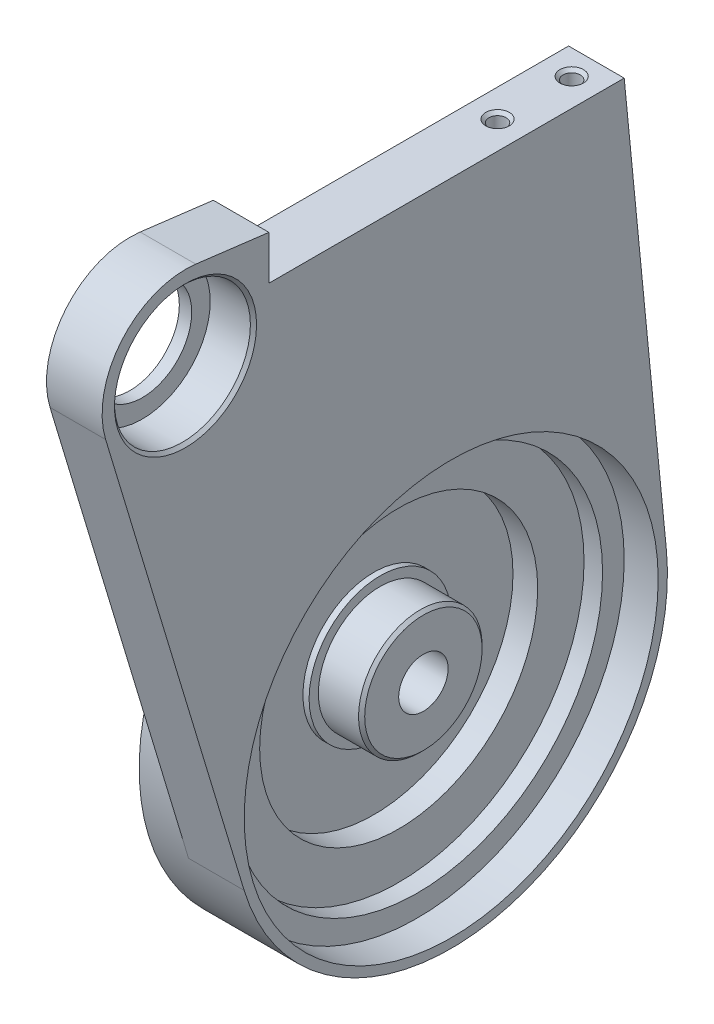
ISO-10303-21;
HEADER;
FILE_DESCRIPTION(('STEP AP214'),'2;1');
FILE_NAME('part.step','',(''),(''),'','','');
FILE_SCHEMA(('AUTOMOTIVE_DESIGN { 1 0 10303 214 1 1 1 1 }'));
ENDSEC;
DATA;
#1=APPLICATION_CONTEXT('core data for automotive mechanical design processes');
#2=APPLICATION_PROTOCOL_DEFINITION('international standard','automotive_design',2000,#1);
#3=PRODUCT_CONTEXT('',#1,'mechanical');
#4=PRODUCT('Part','Part','',(#3));
#5=PRODUCT_RELATED_PRODUCT_CATEGORY('part','',(#4));
#6=PRODUCT_DEFINITION_FORMATION('','',#4);
#7=PRODUCT_DEFINITION_CONTEXT('part definition',#1,'design');
#8=PRODUCT_DEFINITION('design','',#6,#7);
#9=PRODUCT_DEFINITION_SHAPE('','',#8);
#10=(LENGTH_UNIT() NAMED_UNIT(*) SI_UNIT(.MILLI.,.METRE.));
#11=(NAMED_UNIT(*) PLANE_ANGLE_UNIT() SI_UNIT($,.RADIAN.));
#12=(NAMED_UNIT(*) SI_UNIT($,.STERADIAN.) SOLID_ANGLE_UNIT());
#13=UNCERTAINTY_MEASURE_WITH_UNIT(LENGTH_MEASURE(1.E-05),#10,'distance_accuracy_value','');
#14=(GEOMETRIC_REPRESENTATION_CONTEXT(3) GLOBAL_UNCERTAINTY_ASSIGNED_CONTEXT((#13)) GLOBAL_UNIT_ASSIGNED_CONTEXT((#10,
#11,#12)) REPRESENTATION_CONTEXT('',''));
#15=CARTESIAN_POINT('',(0.,0.,0.));
#16=DIRECTION('',(0.,0.,1.));
#17=DIRECTION('',(1.,0.,0.));
#18=AXIS2_PLACEMENT_3D('',#15,#16,#17);
#19=CARTESIAN_POINT('',(-39.,0.,0.));
#20=DIRECTION('',(-1.,0.,0.));
#21=DIRECTION('',(0.,0.,1.));
#22=AXIS2_PLACEMENT_3D('',#19,#20,#21);
#23=CYLINDRICAL_SURFACE('',#22,35.);
#24=DIRECTION('',(-1.,0.,0.));
#25=VECTOR('',#24,1.);
#26=CARTESIAN_POINT('',(-49.5,34.8134096858353,3.60922513099308));
#27=LINE('',#26,#25);
#28=CARTESIAN_POINT('',(-49.,34.8134096858353,3.60922513099308));
#29=VERTEX_POINT('',#28);
#30=CARTESIAN_POINT('',(-51.,34.8134096858353,3.60922513099308));
#31=VERTEX_POINT('',#30);
#32=EDGE_CURVE('E195',#29,#31,#27,.T.);
#33=ORIENTED_EDGE('',*,*,#32,.F.);
#34=CARTESIAN_POINT('',(-49.,34.8134096858353,3.60922513099308));
#35=CARTESIAN_POINT('',(-48.9726356121736,34.8134094352451,3.60922569305726));
#36=CARTESIAN_POINT('',(-48.9452847121818,34.8135305500028,3.60805951301618));
#37=CARTESIAN_POINT('',(-48.8907864964406,34.8140119646794,3.60341213762526));
#38=CARTESIAN_POINT('',(-48.8636391508467,34.8143722288132,3.5999312886317));
#39=CARTESIAN_POINT('',(-48.7829121911346,34.8158036957728,3.58607090046661));
#40=CARTESIAN_POINT('',(-48.7298860989902,34.817225616827,3.5722732710529));
#41=CARTESIAN_POINT('',(-48.626937297955,34.8209224871209,3.53605484832459));
#42=CARTESIAN_POINT('',(-48.5770145523576,34.8231974262688,3.51363415702679));
#43=CARTESIAN_POINT('',(-48.4815436387015,34.8284754079396,3.46092471558382));
#44=CARTESIAN_POINT('',(-48.435996411843,34.831478606628,3.43063427777692));
#45=CARTESIAN_POINT('',(-48.3495567492925,34.8381269942425,3.36245454411341));
#46=CARTESIAN_POINT('',(-48.3087759469558,34.8417838473524,3.32442507321176));
#47=CARTESIAN_POINT('',(-48.2339186226643,34.8495232044921,3.2422880624267));
#48=CARTESIAN_POINT('',(-48.1998440093348,34.853605829195,3.19817879825023));
#49=CARTESIAN_POINT('',(-48.1380694553502,34.8621769230677,3.10337957879432));
#50=CARTESIAN_POINT('',(-48.110651710087,34.8666748156835,3.05250664127353));
#51=CARTESIAN_POINT('',(-48.0645569313515,34.8757542131405,2.94695943233439));
#52=CARTESIAN_POINT('',(-48.0458773749463,34.8803356934504,2.89228626338044));
#53=CARTESIAN_POINT('',(-48.0212581493575,34.8882752153471,2.79463994487654));
#54=CARTESIAN_POINT('',(-48.0132995419636,34.8916523206117,2.75216550508537));
#55=CARTESIAN_POINT('',(-48.002669499544,34.8982964731773,2.66660255618611));
#56=CARTESIAN_POINT('',(-47.9999919401606,34.901563643639,2.62351481681534));
#57=CARTESIAN_POINT('',(-48.,34.9047492831922,2.58040258050802));
#58=B_SPLINE_CURVE_WITH_KNOTS('',3,(#34,#35,#36,#37,#38,#39,#40,#41,#42,#43,#44,#45,#46,#47,#48,
#49,#50,#51,#52,#53,#54,#55,#56,#57),.UNSPECIFIED.,.F.,.F.,(4,2,2,2,2,2,2,2,2,2,2,4),(0.,
0.0820414744675156,0.164070675392366,0.32765072824154,0.49122884588489,0.654842071739815,
0.821735608814192,0.988676576411267,1.16178843583303,1.33485028264958,1.46457326948109,
1.59414572971458),.UNSPECIFIED.);
#59=CARTESIAN_POINT('',(-48.,34.9047492831922,2.58040258050802));
#60=VERTEX_POINT('',#59);
#61=EDGE_CURVE('E64',#29,#60,#58,.T.);
#62=ORIENTED_EDGE('',*,*,#61,.T.);
#63=CARTESIAN_POINT('',(-48.,0.,0.));
#64=DIRECTION('',(1.,0.,0.));
#65=DIRECTION('',(0.,0.,-1.));
#66=AXIS2_PLACEMENT_3D('',#63,#64,#65);
#67=CIRCLE('',#66,35.);
#68=CARTESIAN_POINT('',(-48.,3.42042393123537,-34.8324661792793));
#69=VERTEX_POINT('',#68);
#70=EDGE_CURVE('E231',#60,#69,#67,.F.);
#71=ORIENTED_EDGE('',*,*,#70,.T.);
#72=DIRECTION('',(-1.,0.,0.));
#73=VECTOR('',#72,1.);
#74=CARTESIAN_POINT('',(-39.,3.42042393123537,-34.8324661792793));
#75=LINE('',#74,#73);
#76=CARTESIAN_POINT('',(-39.,3.42042393123537,-34.8324661792793));
#77=VERTEX_POINT('',#76);
#78=EDGE_CURVE('E285',#77,#69,#75,.T.);
#79=ORIENTED_EDGE('',*,*,#78,.F.);
#80=CARTESIAN_POINT('',(-39.,0.,0.));
#81=DIRECTION('',(1.,0.,0.));
#82=DIRECTION('',(0.,0.,-1.));
#83=AXIS2_PLACEMENT_3D('',#80,#81,#82);
#84=CIRCLE('',#83,35.);
#85=CARTESIAN_POINT('',(-39.,-10.0957470928432,33.5123244588815));
#86=VERTEX_POINT('',#85);
#87=EDGE_CURVE('E254',#86,#77,#84,.T.);
#88=ORIENTED_EDGE('',*,*,#87,.F.);
#89=DIRECTION('',(-1.,0.,0.));
#90=VECTOR('',#89,1.);
#91=CARTESIAN_POINT('',(-39.,-10.0957470928432,33.5123244588815));
#92=LINE('',#91,#90);
#93=CARTESIAN_POINT('',(-48.,-10.0957470928432,33.5123244588815));
#94=VERTEX_POINT('',#93);
#95=EDGE_CURVE('E267',#86,#94,#92,.T.);
#96=ORIENTED_EDGE('',*,*,#95,.T.);
#97=CARTESIAN_POINT('',(-48.,31.2349355305614,15.7917320899791));
#98=VERTEX_POINT('',#97);
#99=EDGE_CURVE('E232',#94,#98,#67,.F.);
#100=ORIENTED_EDGE('',*,*,#99,.T.);
#101=CARTESIAN_POINT('',(-48.,31.2349355305614,15.7917320899791));
#102=CARTESIAN_POINT('',(-47.9999592632382,31.2616744252843,15.7388572138157));
#103=CARTESIAN_POINT('',(-48.0050121835829,31.2882606540519,15.6859256306739));
#104=CARTESIAN_POINT('',(-48.0249308728801,31.3404177754603,15.581447752128));
#105=CARTESIAN_POINT('',(-48.0397931056785,31.3659890304682,15.5299009644858));
#106=CARTESIAN_POINT('',(-48.0789645408244,31.4154366771404,15.4296304619864));
#107=CARTESIAN_POINT('',(-48.1032776388826,31.4393123650744,15.3809079208321));
#108=CARTESIAN_POINT('',(-48.1607006999334,31.4847165854457,15.287750032336));
#109=CARTESIAN_POINT('',(-48.1938088531873,31.506245599469,15.2433138055702));
#110=CARTESIAN_POINT('',(-48.2677831373511,31.5462657534545,15.1603177552285));
#111=CARTESIAN_POINT('',(-48.3086081974847,31.5647720505674,15.121728686835));
#112=CARTESIAN_POINT('',(-48.3970623415213,31.5983506779795,15.051436993619));
#113=CARTESIAN_POINT('',(-48.4446919969584,31.6134227195511,15.0197349478182));
#114=CARTESIAN_POINT('',(-48.543968699383,31.6392859195574,14.9651754297504));
#115=CARTESIAN_POINT('',(-48.5954635886536,31.6501863189463,14.9420927106323));
#116=CARTESIAN_POINT('',(-48.7021019951056,31.6679397000589,14.9044299933955));
#117=CARTESIAN_POINT('',(-48.7572411412375,31.6747974361222,14.8898400077256));
#118=CARTESIAN_POINT('',(-48.8440658989104,31.6821099223784,14.8742712566105));
#119=CARTESIAN_POINT('',(-48.87509537446,31.6840576967791,14.870121141594));
#120=CARTESIAN_POINT('',(-48.9374111252453,31.6866554928566,14.8645843372343));
#121=CARTESIAN_POINT('',(-48.968696995447,31.6873072697895,14.8631939102659));
#122=CARTESIAN_POINT('',(-49.,31.687306646543,14.8631960724453));
#123=B_SPLINE_CURVE_WITH_KNOTS('',3,(#101,#102,#103,#104,#105,#106,#107,#108,#109,#110,#111,
#112,#113,#114,#115,#116,#117,#118,#119,#120,#121,#122),.UNSPECIFIED.,.F.,.F.,(4,2,2,2,2,2,2,2,
2,2,4),(0.,0.177513985198611,0.3549640133935,0.532487265389794,0.709974017083849,
0.886541473270198,1.0631237685023,1.23470038567406,1.40607481699872,1.50004007936717,
1.59387799137899),.UNSPECIFIED.);
#124=CARTESIAN_POINT('',(-49.,31.687306646543,14.8631960724453));
#125=VERTEX_POINT('',#124);
#126=EDGE_CURVE('E312',#98,#125,#123,.T.);
#127=ORIENTED_EDGE('',*,*,#126,.T.);
#128=DIRECTION('',(-1.,0.,0.));
#129=VECTOR('',#128,1.);
#130=CARTESIAN_POINT('',(-49.5,31.687306646543,14.8631960724453));
#131=LINE('',#130,#129);
#132=CARTESIAN_POINT('',(-51.,31.687306646543,14.8631960724453));
#133=VERTEX_POINT('',#132);
#134=EDGE_CURVE('E192',#133,#125,#131,.F.);
#135=ORIENTED_EDGE('',*,*,#134,.F.);
#136=CARTESIAN_POINT('',(-51.,0.,0.));
#137=DIRECTION('',(1.,0.,0.));
#138=DIRECTION('',(0.,0.,-1.));
#139=AXIS2_PLACEMENT_3D('',#136,#137,#138);
#140=CIRCLE('',#139,35.);
#141=EDGE_CURVE('E306',#31,#133,#140,.T.);
#142=ORIENTED_EDGE('',*,*,#141,.F.);
#143=EDGE_LOOP('',(#33,#62,#71,#79,#88,#96,#100,#127,#135,#142));
#144=FACE_BOUND('',#143,.T.);
#145=DIRECTION('',(-1.,0.,0.));
#146=VECTOR('',#145,1.);
#147=CARTESIAN_POINT('',(-39.,29.7,18.5178292464317));
#148=LINE('',#147,#146);
#149=CARTESIAN_POINT('',(-54.5,29.7,18.5178292464317));
#150=VERTEX_POINT('',#149);
#151=CARTESIAN_POINT('',(-51.5,29.7,18.5178292464317));
#152=VERTEX_POINT('',#151);
#153=EDGE_CURVE('E149',#150,#152,#148,.F.);
#154=ORIENTED_EDGE('',*,*,#153,.F.);
#155=CARTESIAN_POINT('',(-54.5,0.,0.));
#156=DIRECTION('',(-1.,0.,0.));
#157=DIRECTION('',(0.,0.,1.));
#158=AXIS2_PLACEMENT_3D('',#155,#156,#157);
#159=CIRCLE('',#158,35.);
#160=CARTESIAN_POINT('',(-54.5,34.5246608769892,5.74872084283876));
#161=VERTEX_POINT('',#160);
#162=EDGE_CURVE('E225',#161,#150,#159,.T.);
#163=ORIENTED_EDGE('',*,*,#162,.F.);
#164=DIRECTION('',(-1.,0.,0.));
#165=VECTOR('',#164,1.);
#166=CARTESIAN_POINT('',(-53.,34.5246608769893,5.74872084283872));
#167=LINE('',#166,#165);
#168=CARTESIAN_POINT('',(-51.5,34.5246608769893,5.74872084283873));
#169=VERTEX_POINT('',#168);
#170=EDGE_CURVE('E206',#169,#161,#167,.T.);
#171=ORIENTED_EDGE('',*,*,#170,.F.);
#172=CARTESIAN_POINT('',(-51.5,0.,0.));
#173=DIRECTION('',(1.,0.,0.));
#174=DIRECTION('',(0.,0.,-1.));
#175=AXIS2_PLACEMENT_3D('',#172,#173,#174);
#176=CIRCLE('',#175,35.);
#177=EDGE_CURVE('E290',#169,#152,#176,.T.);
#178=ORIENTED_EDGE('',*,*,#177,.T.);
#179=EDGE_LOOP('',(#154,#163,#171,#178));
#180=FACE_BOUND('',#179,.T.);
#181=ADVANCED_FACE('F40',(#144,#180),#23,.T.);
#182=CARTESIAN_POINT('',(-54.5,4.,0.));
#183=DIRECTION('',(1.,0.,0.));
#184=DIRECTION('',(0.,0.,-1.));
#185=AXIS2_PLACEMENT_3D('',#182,#183,#184);
#186=PLANE('',#185);
#187=CARTESIAN_POINT('',(-54.5,0.,0.));
#188=DIRECTION('',(-1.,0.,0.));
#189=DIRECTION('',(0.,0.,1.));
#190=AXIS2_PLACEMENT_3D('',#187,#188,#189);
#191=CIRCLE('',#190,4.);
#192=CARTESIAN_POINT('',(-54.5,0.,4.));
#193=VERTEX_POINT('',#192);
#194=EDGE_CURVE('E228',#193,#193,#191,.T.);
#195=ORIENTED_EDGE('',*,*,#194,.F.);
#196=EDGE_LOOP('',(#195));
#197=FACE_BOUND('',#196,.T.);
#198=DIRECTION('',(0.,1.,0.));
#199=VECTOR('',#198,1.);
#200=CARTESIAN_POINT('',(-54.5,42.3,10.));
#201=LINE('',#200,#199);
#202=CARTESIAN_POINT('',(-54.5,29.7,10.));
#203=VERTEX_POINT('',#202);
#204=CARTESIAN_POINT('',(-54.5,31.5,10.));
#205=VERTEX_POINT('',#204);
#206=EDGE_CURVE('E158',#203,#205,#201,.T.);
#207=ORIENTED_EDGE('',*,*,#206,.T.);
#208=CARTESIAN_POINT('',(-54.5,36.,10.));
#209=DIRECTION('',(1.,0.,0.));
#210=DIRECTION('',(0.,0.,-1.));
#211=AXIS2_PLACEMENT_3D('',#208,#209,#210);
#212=CIRCLE('',#211,4.5);
#213=EDGE_CURVE('E204',#205,#161,#212,.T.);
#214=ORIENTED_EDGE('',*,*,#213,.T.);
#215=ORIENTED_EDGE('',*,*,#162,.T.);
#216=DIRECTION('',(0.,0.,-1.));
#217=VECTOR('',#216,1.);
#218=CARTESIAN_POINT('',(-54.5,29.7,10.));
#219=LINE('',#218,#217);
#220=EDGE_CURVE('E164',#150,#203,#219,.T.);
#221=ORIENTED_EDGE('',*,*,#220,.T.);
#222=EDGE_LOOP('',(#207,#214,#215,#221));
#223=FACE_BOUND('',#222,.T.);
#224=ADVANCED_FACE('F332',(#197,#223),#186,.F.);
#225=CARTESIAN_POINT('',(-51.5,36.,10.));
#226=DIRECTION('',(-1.,0.,0.));
#227=DIRECTION('',(0.,0.,1.));
#228=AXIS2_PLACEMENT_3D('',#225,#226,#227);
#229=CYLINDRICAL_SURFACE('',#228,4.5);
#230=ORIENTED_EDGE('',*,*,#213,.F.);
#231=DIRECTION('',(-1.,0.,0.));
#232=VECTOR('',#231,1.);
#233=CARTESIAN_POINT('',(-51.5,31.5,10.));
#234=LINE('',#233,#232);
#235=CARTESIAN_POINT('',(-51.5,31.5,10.));
#236=VERTEX_POINT('',#235);
#237=EDGE_CURVE('E11',#205,#236,#234,.F.);
#238=ORIENTED_EDGE('',*,*,#237,.T.);
#239=CARTESIAN_POINT('',(-51.5,36.,10.));
#240=DIRECTION('',(1.,0.,0.));
#241=DIRECTION('',(0.,0.,-1.));
#242=AXIS2_PLACEMENT_3D('',#239,#240,#241);
#243=CIRCLE('',#242,4.5);
#244=EDGE_CURVE('E163',#236,#169,#243,.T.);
#245=ORIENTED_EDGE('',*,*,#244,.T.);
#246=ORIENTED_EDGE('',*,*,#170,.T.);
#247=EDGE_LOOP('',(#230,#238,#245,#246));
#248=FACE_BOUND('',#247,.T.);
#249=ADVANCED_FACE('F382',(#248),#229,.F.);
#250=CARTESIAN_POINT('',(-51.5,0.,0.));
#251=DIRECTION('',(1.,0.,0.));
#252=DIRECTION('',(0.,0.,-1.));
#253=AXIS2_PLACEMENT_3D('',#250,#251,#252);
#254=CYLINDRICAL_SURFACE('',#253,22.5);
#255=CARTESIAN_POINT('',(-51.5,0.,0.));
#256=DIRECTION('',(-1.,0.,0.));
#257=DIRECTION('',(0.,0.,1.));
#258=AXIS2_PLACEMENT_3D('',#255,#256,#257);
#259=CIRCLE('',#258,22.5);
#260=CARTESIAN_POINT('',(-51.5,0.,22.5));
#261=VERTEX_POINT('',#260);
#262=EDGE_CURVE('E222',#261,#261,#259,.T.);
#263=ORIENTED_EDGE('',*,*,#262,.T.);
#264=EDGE_LOOP('',(#263));
#265=FACE_BOUND('',#264,.T.);
#266=CARTESIAN_POINT('',(-47.5,0.,0.));
#267=DIRECTION('',(1.,0.,0.));
#268=DIRECTION('',(0.,0.,-1.));
#269=AXIS2_PLACEMENT_3D('',#266,#267,#268);
#270=CIRCLE('',#269,22.5);
#271=CARTESIAN_POINT('',(-47.5,0.,-22.5));
#272=VERTEX_POINT('',#271);
#273=EDGE_CURVE('E174',#272,#272,#270,.F.);
#274=ORIENTED_EDGE('',*,*,#273,.F.);
#275=EDGE_LOOP('',(#274));
#276=FACE_BOUND('',#275,.T.);
#277=ADVANCED_FACE('F377',(#265,#276),#254,.F.);
#278=CARTESIAN_POINT('',(-39.,68.2,43.));
#279=DIRECTION('',(-1.,0.,0.));
#280=DIRECTION('',(0.,0.,1.));
#281=AXIS2_PLACEMENT_3D('',#278,#279,#280);
#282=CYLINDRICAL_SURFACE('',#281,8.);
#283=CARTESIAN_POINT('',(-48.,68.2,43.));
#284=DIRECTION('',(1.,0.,0.));
#285=DIRECTION('',(0.,0.,-1.));
#286=AXIS2_PLACEMENT_3D('',#283,#284,#285);
#287=CIRCLE('',#286,8.);
#288=CARTESIAN_POINT('',(-48.,68.2,35.));
#289=VERTEX_POINT('',#288);
#290=EDGE_CURVE('E201',#289,#289,#287,.T.);
#291=ORIENTED_EDGE('',*,*,#290,.F.);
#292=EDGE_LOOP('',(#291));
#293=FACE_BOUND('',#292,.T.);
#294=CARTESIAN_POINT('',(-46.,68.2,43.));
#295=DIRECTION('',(1.,0.,0.));
#296=DIRECTION('',(0.,0.,-1.));
#297=AXIS2_PLACEMENT_3D('',#294,#295,#296);
#298=CIRCLE('',#297,8.);
#299=CARTESIAN_POINT('',(-46.,68.2,35.));
#300=VERTEX_POINT('',#299);
#301=EDGE_CURVE('E200',#300,#300,#298,.T.);
#302=ORIENTED_EDGE('',*,*,#301,.T.);
#303=EDGE_LOOP('',(#302));
#304=FACE_BOUND('',#303,.T.);
#305=ADVANCED_FACE('F373',(#293,#304),#282,.F.);
#306=CARTESIAN_POINT('',(-48.,0.,0.));
#307=DIRECTION('',(1.,0.,0.));
#308=DIRECTION('',(0.,0.,-1.));
#309=AXIS2_PLACEMENT_3D('',#306,#307,#308);
#310=PLANE('',#309);
#311=ORIENTED_EDGE('',*,*,#70,.F.);
#312=CARTESIAN_POINT('',(-48.,36.,10.));
#313=DIRECTION('',(1.,0.,0.));
#314=DIRECTION('',(0.,0.,-1.));
#315=AXIS2_PLACEMENT_3D('',#312,#313,#314);
#316=CIRCLE('',#315,7.5);
#317=EDGE_CURVE('E56',#60,#98,#316,.T.);
#318=ORIENTED_EDGE('',*,*,#317,.T.);
#319=ORIENTED_EDGE('',*,*,#99,.F.);
#320=DIRECTION('',(0.,-0.957494984539472,-0.288449916938376));
#321=VECTOR('',#320,1.);
#322=CARTESIAN_POINT('',(-48.,64.3059261213319,55.9261822912829));
#323=LINE('',#322,#321);
#324=CARTESIAN_POINT('',(-48.,64.3059261213319,55.9261822912829));
#325=VERTEX_POINT('',#324);
#326=EDGE_CURVE('E258',#325,#94,#323,.T.);
#327=ORIENTED_EDGE('',*,*,#326,.F.);
#328=CARTESIAN_POINT('',(-48.,68.2,43.));
#329=DIRECTION('',(1.,0.,0.));
#330=DIRECTION('',(0.,0.,-1.));
#331=AXIS2_PLACEMENT_3D('',#328,#329,#330);
#332=CIRCLE('',#331,13.5);
#333=CARTESIAN_POINT('',(-48.,81.5974080947529,41.3388388571093));
#334=VERTEX_POINT('',#333);
#335=EDGE_CURVE('E272',#334,#325,#332,.T.);
#336=ORIENTED_EDGE('',*,*,#335,.F.);
#337=DIRECTION('',(0.,0.123048973547403,0.992400599611332));
#338=VECTOR('',#337,1.);
#339=CARTESIAN_POINT('',(-48.,73.,-28.));
#340=LINE('',#339,#338);
#341=CARTESIAN_POINT('',(-48.,80.1294958726815,29.5));
#342=VERTEX_POINT('',#341);
#343=EDGE_CURVE('E270',#342,#334,#340,.T.);
#344=ORIENTED_EDGE('',*,*,#343,.F.);
#345=DIRECTION('',(0.,1.,0.));
#346=VECTOR('',#345,1.);
#347=CARTESIAN_POINT('',(-48.,0.,29.5));
#348=LINE('',#347,#346);
#349=CARTESIAN_POINT('',(-48.,73.,29.5));
#350=VERTEX_POINT('',#349);
#351=EDGE_CURVE('E288',#350,#342,#348,.T.);
#352=ORIENTED_EDGE('',*,*,#351,.F.);
#353=DIRECTION('',(0.,0.,-1.));
#354=VECTOR('',#353,1.);
#355=CARTESIAN_POINT('',(-48.,73.,29.5));
#356=LINE('',#355,#354);
#357=CARTESIAN_POINT('',(-48.,73.,-28.));
#358=VERTEX_POINT('',#357);
#359=EDGE_CURVE('E238',#350,#358,#356,.T.);
#360=ORIENTED_EDGE('',*,*,#359,.T.);
#361=DIRECTION('',(0.,0.995213319407978,0.0977263980352962));
#362=VECTOR('',#361,1.);
#363=CARTESIAN_POINT('',(-48.,3.42042393123537,-34.8324661792793));
#364=LINE('',#363,#362);
#365=EDGE_CURVE('E253',#69,#358,#364,.T.);
#366=ORIENTED_EDGE('',*,*,#365,.F.);
#367=EDGE_LOOP('',(#311,#318,#319,#327,#336,#344,#352,#360,#366));
#368=FACE_BOUND('',#367,.T.);
#369=ORIENTED_EDGE('',*,*,#290,.T.);
#370=EDGE_LOOP('',(#369));
#371=FACE_BOUND('',#370,.T.);
#372=ADVANCED_FACE('F376',(#368,#371),#310,.F.);
#373=CARTESIAN_POINT('',(-39.,73.,-28.));
#374=DIRECTION('',(0.,-0.992400599611332,0.123048973547403));
#375=DIRECTION('',(0.,-0.123048973547403,-0.992400599611332));
#376=AXIS2_PLACEMENT_3D('',#373,#374,#375);
#377=PLANE('',#376);
#378=DIRECTION('',(1.,0.,0.));
#379=VECTOR('',#378,1.);
#380=CARTESIAN_POINT('',(-39.,80.1294958726815,29.5));
#381=LINE('',#380,#379);
#382=CARTESIAN_POINT('',(-39.,80.1294958726815,29.5));
#383=VERTEX_POINT('',#382);
#384=EDGE_CURVE('E251',#342,#383,#381,.T.);
#385=ORIENTED_EDGE('',*,*,#384,.F.);
#386=ORIENTED_EDGE('',*,*,#343,.T.);
#387=DIRECTION('',(-1.,0.,0.));
#388=VECTOR('',#387,1.);
#389=CARTESIAN_POINT('',(-39.,81.5974080947529,41.3388388571093));
#390=LINE('',#389,#388);
#391=CARTESIAN_POINT('',(-39.,81.5974080947529,41.3388388571093));
#392=VERTEX_POINT('',#391);
#393=EDGE_CURVE('E280',#392,#334,#390,.T.);
#394=ORIENTED_EDGE('',*,*,#393,.F.);
#395=DIRECTION('',(0.,0.123048973547403,0.992400599611332));
#396=VECTOR('',#395,1.);
#397=CARTESIAN_POINT('',(-39.,73.,-28.));
#398=LINE('',#397,#396);
#399=EDGE_CURVE('E261',#383,#392,#398,.T.);
#400=ORIENTED_EDGE('',*,*,#399,.F.);
#401=EDGE_LOOP('',(#385,#386,#394,#400));
#402=FACE_BOUND('',#401,.T.);
#403=ADVANCED_FACE('F435',(#402),#377,.F.);
#404=CARTESIAN_POINT('',(-39.,0.,0.));
#405=DIRECTION('',(1.,0.,0.));
#406=DIRECTION('',(0.,0.,-1.));
#407=AXIS2_PLACEMENT_3D('',#404,#405,#406);
#408=PLANE('',#407);
#409=CARTESIAN_POINT('',(-39.,68.2,43.));
#410=DIRECTION('',(1.,0.,0.));
#411=DIRECTION('',(0.,0.,-1.));
#412=AXIS2_PLACEMENT_3D('',#409,#410,#411);
#413=CIRCLE('',#412,11.5);
#414=CARTESIAN_POINT('',(-39.,68.2,31.5));
#415=VERTEX_POINT('',#414);
#416=EDGE_CURVE('E303',#415,#415,#413,.F.);
#417=ORIENTED_EDGE('',*,*,#416,.T.);
#418=EDGE_LOOP('',(#417));
#419=FACE_BOUND('',#418,.T.);
#420=CARTESIAN_POINT('',(-39.,0.,0.));
#421=DIRECTION('',(1.,0.,0.));
#422=DIRECTION('',(0.,0.,-1.));
#423=AXIS2_PLACEMENT_3D('',#420,#421,#422);
#424=CIRCLE('',#423,33.5);
#425=CARTESIAN_POINT('',(-39.,0.,-33.5));
#426=VERTEX_POINT('',#425);
#427=EDGE_CURVE('E234',#426,#426,#424,.T.);
#428=ORIENTED_EDGE('',*,*,#427,.F.);
#429=EDGE_LOOP('',(#428));
#430=FACE_BOUND('',#429,.T.);
#431=CARTESIAN_POINT('',(-39.,68.2,43.));
#432=DIRECTION('',(1.,0.,0.));
#433=DIRECTION('',(0.,0.,-1.));
#434=AXIS2_PLACEMENT_3D('',#431,#432,#433);
#435=CIRCLE('',#434,13.5);
#436=CARTESIAN_POINT('',(-39.,64.3059261213319,55.9261822912829));
#437=VERTEX_POINT('',#436);
#438=EDGE_CURVE('E263',#392,#437,#435,.T.);
#439=ORIENTED_EDGE('',*,*,#438,.T.);
#440=DIRECTION('',(0.,-0.957494984539472,-0.288449916938376));
#441=VECTOR('',#440,1.);
#442=CARTESIAN_POINT('',(-39.,64.3059261213319,55.9261822912829));
#443=LINE('',#442,#441);
#444=EDGE_CURVE('E265',#437,#86,#443,.T.);
#445=ORIENTED_EDGE('',*,*,#444,.T.);
#446=ORIENTED_EDGE('',*,*,#87,.T.);
#447=DIRECTION('',(0.,0.995213319407978,0.0977263980352962));
#448=VECTOR('',#447,1.);
#449=CARTESIAN_POINT('',(-39.,3.42042393123537,-34.8324661792793));
#450=LINE('',#449,#448);
#451=CARTESIAN_POINT('',(-39.,73.,-28.));
#452=VERTEX_POINT('',#451);
#453=EDGE_CURVE('E257',#77,#452,#450,.T.);
#454=ORIENTED_EDGE('',*,*,#453,.T.);
#455=DIRECTION('',(0.,0.,1.));
#456=VECTOR('',#455,1.);
#457=CARTESIAN_POINT('',(-39.,73.,0.));
#458=LINE('',#457,#456);
#459=CARTESIAN_POINT('',(-39.,73.,29.5));
#460=VERTEX_POINT('',#459);
#461=EDGE_CURVE('E245',#452,#460,#458,.T.);
#462=ORIENTED_EDGE('',*,*,#461,.T.);
#463=DIRECTION('',(0.,1.,0.));
#464=VECTOR('',#463,1.);
#465=CARTESIAN_POINT('',(-39.,0.,29.5));
#466=LINE('',#465,#464);
#467=EDGE_CURVE('E248',#460,#383,#466,.T.);
#468=ORIENTED_EDGE('',*,*,#467,.T.);
#469=ORIENTED_EDGE('',*,*,#399,.T.);
#470=EDGE_LOOP('',(#439,#445,#446,#454,#462,#468,#469));
#471=FACE_BOUND('',#470,.T.);
#472=ADVANCED_FACE('F432',(#419,#430,#471),#408,.T.);
#473=CARTESIAN_POINT('',(-39.,3.42042393123537,-34.8324661792793));
#474=DIRECTION('',(0.,-0.0977263980352962,0.995213319407978));
#475=DIRECTION('',(0.,-0.995213319407978,-0.0977263980352962));
#476=AXIS2_PLACEMENT_3D('',#473,#474,#475);
#477=PLANE('',#476);
#478=ORIENTED_EDGE('',*,*,#365,.T.);
#479=DIRECTION('',(-1.,0.,0.));
#480=VECTOR('',#479,1.);
#481=CARTESIAN_POINT('',(-39.,73.,-28.));
#482=LINE('',#481,#480);
#483=EDGE_CURVE('E283',#452,#358,#482,.T.);
#484=ORIENTED_EDGE('',*,*,#483,.F.);
#485=ORIENTED_EDGE('',*,*,#453,.F.);
#486=ORIENTED_EDGE('',*,*,#78,.T.);
#487=EDGE_LOOP('',(#478,#484,#485,#486));
#488=FACE_BOUND('',#487,.T.);
#489=ADVANCED_FACE('F333',(#488),#477,.F.);
#490=CARTESIAN_POINT('',(-39.,68.2,43.));
#491=DIRECTION('',(-1.,0.,0.));
#492=DIRECTION('',(0.,0.,1.));
#493=AXIS2_PLACEMENT_3D('',#490,#491,#492);
#494=CYLINDRICAL_SURFACE('',#493,13.5);
#495=ORIENTED_EDGE('',*,*,#335,.T.);
#496=DIRECTION('',(-1.,0.,0.));
#497=VECTOR('',#496,1.);
#498=CARTESIAN_POINT('',(-39.,64.3059261213319,55.9261822912829));
#499=LINE('',#498,#497);
#500=EDGE_CURVE('E277',#437,#325,#499,.T.);
#501=ORIENTED_EDGE('',*,*,#500,.F.);
#502=ORIENTED_EDGE('',*,*,#438,.F.);
#503=ORIENTED_EDGE('',*,*,#393,.T.);
#504=EDGE_LOOP('',(#495,#501,#502,#503));
#505=FACE_BOUND('',#504,.T.);
#506=ADVANCED_FACE('F441',(#505),#494,.T.);
#507=CARTESIAN_POINT('',(-39.,64.3059261213319,55.9261822912829));
#508=DIRECTION('',(0.,0.288449916938376,-0.957494984539472));
#509=DIRECTION('',(0.,0.957494984539472,0.288449916938377));
#510=AXIS2_PLACEMENT_3D('',#507,#508,#509);
#511=PLANE('',#510);
#512=ORIENTED_EDGE('',*,*,#326,.T.);
#513=ORIENTED_EDGE('',*,*,#95,.F.);
#514=ORIENTED_EDGE('',*,*,#444,.F.);
#515=ORIENTED_EDGE('',*,*,#500,.T.);
#516=EDGE_LOOP('',(#512,#513,#514,#515));
#517=FACE_BOUND('',#516,.T.);
#518=ADVANCED_FACE('F430',(#517),#511,.F.);
#519=CARTESIAN_POINT('',(-8.,150.,29.5));
#520=DIRECTION('',(0.,0.,-1.));
#521=DIRECTION('',(-1.,0.,0.));
#522=AXIS2_PLACEMENT_3D('',#519,#520,#521);
#523=PLANE('',#522);
#524=ORIENTED_EDGE('',*,*,#384,.T.);
#525=ORIENTED_EDGE('',*,*,#467,.F.);
#526=DIRECTION('',(-1.,0.,0.));
#527=VECTOR('',#526,1.);
#528=CARTESIAN_POINT('',(-8.,73.,29.5));
#529=LINE('',#528,#527);
#530=EDGE_CURVE('E243',#460,#350,#529,.T.);
#531=ORIENTED_EDGE('',*,*,#530,.T.);
#532=ORIENTED_EDGE('',*,*,#351,.T.);
#533=EDGE_LOOP('',(#524,#525,#531,#532));
#534=FACE_BOUND('',#533,.T.);
#535=ADVANCED_FACE('F426',(#534),#523,.T.);
#536=CARTESIAN_POINT('',(-8.,73.,29.5));
#537=DIRECTION('',(0.,1.,0.));
#538=DIRECTION('',(0.,0.,1.));
#539=AXIS2_PLACEMENT_3D('',#536,#537,#538);
#540=PLANE('',#539);
#541=CARTESIAN_POINT('',(-43.5,73.,-24.));
#542=DIRECTION('',(0.,1.,0.));
#543=DIRECTION('',(0.,0.,1.));
#544=AXIS2_PLACEMENT_3D('',#541,#542,#543);
#545=CIRCLE('',#544,1.89999999999999);
#546=CARTESIAN_POINT('',(-43.5,73.,-22.1));
#547=VERTEX_POINT('',#546);
#548=EDGE_CURVE('E481',#547,#547,#545,.F.);
#549=ORIENTED_EDGE('',*,*,#548,.T.);
#550=EDGE_LOOP('',(#549));
#551=FACE_BOUND('',#550,.T.);
#552=CARTESIAN_POINT('',(-43.5,73.,-12.));
#553=DIRECTION('',(0.,1.,0.));
#554=DIRECTION('',(0.,0.,1.));
#555=AXIS2_PLACEMENT_3D('',#552,#553,#554);
#556=CIRCLE('',#555,1.90000000000003);
#557=CARTESIAN_POINT('',(-43.5,73.,-10.1));
#558=VERTEX_POINT('',#557);
#559=EDGE_CURVE('E476',#558,#558,#556,.F.);
#560=ORIENTED_EDGE('',*,*,#559,.T.);
#561=EDGE_LOOP('',(#560));
#562=FACE_BOUND('',#561,.T.);
#563=ORIENTED_EDGE('',*,*,#483,.T.);
#564=ORIENTED_EDGE('',*,*,#359,.F.);
#565=ORIENTED_EDGE('',*,*,#530,.F.);
#566=ORIENTED_EDGE('',*,*,#461,.F.);
#567=EDGE_LOOP('',(#563,#564,#565,#566));
#568=FACE_BOUND('',#567,.T.);
#569=ADVANCED_FACE('F422',(#551,#562,#568),#540,.T.);
#570=CARTESIAN_POINT('',(-44.5,0.,0.));
#571=DIRECTION('',(1.,0.,0.));
#572=DIRECTION('',(0.,0.,-1.));
#573=AXIS2_PLACEMENT_3D('',#570,#571,#572);
#574=CYLINDRICAL_SURFACE('',#573,33.5);
#575=CARTESIAN_POINT('',(-44.5,0.,0.));
#576=DIRECTION('',(1.,0.,0.));
#577=DIRECTION('',(0.,0.,-1.));
#578=AXIS2_PLACEMENT_3D('',#575,#576,#577);
#579=CIRCLE('',#578,33.5);
#580=CARTESIAN_POINT('',(-44.5,0.,-33.5));
#581=VERTEX_POINT('',#580);
#582=EDGE_CURVE('E235',#581,#581,#579,.T.);
#583=ORIENTED_EDGE('',*,*,#582,.F.);
#584=EDGE_LOOP('',(#583));
#585=FACE_BOUND('',#584,.T.);
#586=ORIENTED_EDGE('',*,*,#427,.T.);
#587=EDGE_LOOP('',(#586));
#588=FACE_BOUND('',#587,.T.);
#589=ADVANCED_FACE('F418',(#585,#588),#574,.F.);
#590=CARTESIAN_POINT('',(-44.5,0.,0.));
#591=DIRECTION('',(1.,0.,0.));
#592=DIRECTION('',(0.,0.,-1.));
#593=AXIS2_PLACEMENT_3D('',#590,#591,#592);
#594=PLANE('',#593);
#595=CARTESIAN_POINT('',(-44.5,0.,0.));
#596=DIRECTION('',(1.,0.,0.));
#597=DIRECTION('',(0.,0.,-1.));
#598=AXIS2_PLACEMENT_3D('',#595,#596,#597);
#599=CIRCLE('',#598,30.);
#600=CARTESIAN_POINT('',(-44.5,0.,-30.));
#601=VERTEX_POINT('',#600);
#602=EDGE_CURVE('E170',#601,#601,#599,.T.);
#603=ORIENTED_EDGE('',*,*,#602,.F.);
#604=EDGE_LOOP('',(#603));
#605=FACE_BOUND('',#604,.T.);
#606=ORIENTED_EDGE('',*,*,#582,.T.);
#607=EDGE_LOOP('',(#606));
#608=FACE_BOUND('',#607,.T.);
#609=ADVANCED_FACE('F411',(#605,#608),#594,.T.);
#610=CARTESIAN_POINT('',(-10.123,0.,0.));
#611=DIRECTION('',(-1.,0.,0.));
#612=DIRECTION('',(0.,0.,1.));
#613=AXIS2_PLACEMENT_3D('',#610,#611,#612);
#614=CYLINDRICAL_SURFACE('',#613,4.);
#615=CARTESIAN_POINT('',(-43.5,0.,0.));
#616=DIRECTION('',(-1.,0.,0.));
#617=DIRECTION('',(0.,0.,1.));
#618=AXIS2_PLACEMENT_3D('',#615,#616,#617);
#619=CIRCLE('',#618,4.);
#620=CARTESIAN_POINT('',(-43.5,0.,4.));
#621=VERTEX_POINT('',#620);
#622=EDGE_CURVE('E210',#621,#621,#619,.T.);
#623=ORIENTED_EDGE('',*,*,#622,.F.);
#624=EDGE_LOOP('',(#623));
#625=FACE_BOUND('',#624,.T.);
#626=ORIENTED_EDGE('',*,*,#194,.T.);
#627=EDGE_LOOP('',(#626));
#628=FACE_BOUND('',#627,.T.);
#629=ADVANCED_FACE('F404',(#625,#628),#614,.F.);
#630=CARTESIAN_POINT('',(-51.5,22.5,0.));
#631=DIRECTION('',(-1.,0.,0.));
#632=DIRECTION('',(0.,0.,1.));
#633=AXIS2_PLACEMENT_3D('',#630,#631,#632);
#634=PLANE('',#633);
#635=ORIENTED_EDGE('',*,*,#262,.F.);
#636=EDGE_LOOP('',(#635));
#637=FACE_BOUND('',#636,.T.);
#638=CARTESIAN_POINT('',(-51.5,0.,0.));
#639=DIRECTION('',(-1.,0.,0.));
#640=DIRECTION('',(0.,0.,1.));
#641=AXIS2_PLACEMENT_3D('',#638,#639,#640);
#642=CIRCLE('',#641,11.5);
#643=CARTESIAN_POINT('',(-51.5,0.,11.5));
#644=VERTEX_POINT('',#643);
#645=EDGE_CURVE('E219',#644,#644,#642,.T.);
#646=ORIENTED_EDGE('',*,*,#645,.T.);
#647=EDGE_LOOP('',(#646));
#648=FACE_BOUND('',#647,.T.);
#649=ADVANCED_FACE('F400',(#637,#648),#634,.F.);
#650=CARTESIAN_POINT('',(-10.123,0.,0.));
#651=DIRECTION('',(-1.,0.,0.));
#652=DIRECTION('',(0.,0.,1.));
#653=AXIS2_PLACEMENT_3D('',#650,#651,#652);
#654=CYLINDRICAL_SURFACE('',#653,11.5);
#655=ORIENTED_EDGE('',*,*,#645,.F.);
#656=EDGE_LOOP('',(#655));
#657=FACE_BOUND('',#656,.T.);
#658=CARTESIAN_POINT('',(-50.5,0.,0.));
#659=DIRECTION('',(-1.,0.,0.));
#660=DIRECTION('',(0.,0.,1.));
#661=AXIS2_PLACEMENT_3D('',#658,#659,#660);
#662=CIRCLE('',#661,11.5);
#663=CARTESIAN_POINT('',(-50.5,0.,11.5));
#664=VERTEX_POINT('',#663);
#665=EDGE_CURVE('E216',#664,#664,#662,.T.);
#666=ORIENTED_EDGE('',*,*,#665,.T.);
#667=EDGE_LOOP('',(#666));
#668=FACE_BOUND('',#667,.T.);
#669=ADVANCED_FACE('F396',(#657,#668),#654,.T.);
#670=CARTESIAN_POINT('',(-50.5,11.5,0.));
#671=DIRECTION('',(-1.,0.,0.));
#672=DIRECTION('',(0.,0.,1.));
#673=AXIS2_PLACEMENT_3D('',#670,#671,#672);
#674=PLANE('',#673);
#675=ORIENTED_EDGE('',*,*,#665,.F.);
#676=EDGE_LOOP('',(#675));
#677=FACE_BOUND('',#676,.T.);
#678=CARTESIAN_POINT('',(-50.5,0.,0.));
#679=DIRECTION('',(-1.,0.,0.));
#680=DIRECTION('',(0.,0.,1.));
#681=AXIS2_PLACEMENT_3D('',#678,#679,#680);
#682=CIRCLE('',#681,10.);
#683=CARTESIAN_POINT('',(-50.5,0.,10.));
#684=VERTEX_POINT('',#683);
#685=EDGE_CURVE('E213',#684,#684,#682,.T.);
#686=ORIENTED_EDGE('',*,*,#685,.T.);
#687=EDGE_LOOP('',(#686));
#688=FACE_BOUND('',#687,.T.);
#689=ADVANCED_FACE('F392',(#677,#688),#674,.F.);
#690=CARTESIAN_POINT('',(-10.123,0.,0.));
#691=DIRECTION('',(-1.,0.,0.));
#692=DIRECTION('',(0.,0.,1.));
#693=AXIS2_PLACEMENT_3D('',#690,#691,#692);
#694=CYLINDRICAL_SURFACE('',#693,10.);
#695=CARTESIAN_POINT('',(-44.,0.,0.));
#696=DIRECTION('',(-1.,0.,0.));
#697=DIRECTION('',(0.,0.,1.));
#698=AXIS2_PLACEMENT_3D('',#695,#696,#697);
#699=CIRCLE('',#698,10.);
#700=CARTESIAN_POINT('',(-44.,0.,10.));
#701=VERTEX_POINT('',#700);
#702=EDGE_CURVE('E292',#701,#701,#699,.T.);
#703=ORIENTED_EDGE('',*,*,#702,.T.);
#704=EDGE_LOOP('',(#703));
#705=FACE_BOUND('',#704,.T.);
#706=ORIENTED_EDGE('',*,*,#685,.F.);
#707=EDGE_LOOP('',(#706));
#708=FACE_BOUND('',#707,.T.);
#709=ADVANCED_FACE('F388',(#705,#708),#694,.T.);
#710=CARTESIAN_POINT('',(-43.5,10.,0.));
#711=DIRECTION('',(-1.,0.,0.));
#712=DIRECTION('',(0.,0.,1.));
#713=AXIS2_PLACEMENT_3D('',#710,#711,#712);
#714=PLANE('',#713);
#715=CARTESIAN_POINT('',(-43.5,0.,0.));
#716=DIRECTION('',(-1.,0.,0.));
#717=DIRECTION('',(0.,0.,1.));
#718=AXIS2_PLACEMENT_3D('',#715,#716,#717);
#719=CIRCLE('',#718,9.49999999999999);
#720=CARTESIAN_POINT('',(-43.5,0.,9.49999999999999));
#721=VERTEX_POINT('',#720);
#722=EDGE_CURVE('E295',#721,#721,#719,.F.);
#723=ORIENTED_EDGE('',*,*,#722,.T.);
#724=EDGE_LOOP('',(#723));
#725=FACE_BOUND('',#724,.T.);
#726=ORIENTED_EDGE('',*,*,#622,.T.);
#727=EDGE_LOOP('',(#726));
#728=FACE_BOUND('',#727,.T.);
#729=ADVANCED_FACE('F381',(#725,#728),#714,.F.);
#730=CARTESIAN_POINT('',(-51.5,36.,10.));
#731=DIRECTION('',(1.,0.,0.));
#732=DIRECTION('',(0.,0.,-1.));
#733=AXIS2_PLACEMENT_3D('',#730,#731,#732);
#734=PLANE('',#733);
#735=DIRECTION('',(0.,0.,-1.));
#736=VECTOR('',#735,1.);
#737=CARTESIAN_POINT('',(-51.5,29.7,10.));
#738=LINE('',#737,#736);
#739=CARTESIAN_POINT('',(-51.5,29.7,10.));
#740=VERTEX_POINT('',#739);
#741=EDGE_CURVE('E143',#152,#740,#738,.T.);
#742=ORIENTED_EDGE('',*,*,#741,.F.);
#743=ORIENTED_EDGE('',*,*,#177,.F.);
#744=ORIENTED_EDGE('',*,*,#244,.F.);
#745=DIRECTION('',(0.,1.,0.));
#746=VECTOR('',#745,1.);
#747=CARTESIAN_POINT('',(-51.5,42.3,10.));
#748=LINE('',#747,#746);
#749=EDGE_CURVE('E153',#740,#236,#748,.T.);
#750=ORIENTED_EDGE('',*,*,#749,.F.);
#751=EDGE_LOOP('',(#742,#743,#744,#750));
#752=FACE_BOUND('',#751,.T.);
#753=ADVANCED_FACE('F162',(#752),#734,.F.);
#754=CARTESIAN_POINT('',(-44.,0.,0.));
#755=DIRECTION('',(-1.,0.,0.));
#756=DIRECTION('',(0.,0.,1.));
#757=AXIS2_PLACEMENT_3D('',#754,#755,#756);
#758=CONICAL_SURFACE('',#757,10.,0.78539816339744);
#759=ORIENTED_EDGE('',*,*,#722,.F.);
#760=EDGE_LOOP('',(#759));
#761=FACE_BOUND('',#760,.T.);
#762=ORIENTED_EDGE('',*,*,#702,.F.);
#763=EDGE_LOOP('',(#762));
#764=FACE_BOUND('',#763,.T.);
#765=ADVANCED_FACE('F336',(#761,#764),#758,.T.);
#766=CARTESIAN_POINT('',(-46.,68.2,43.));
#767=DIRECTION('',(1.,0.,0.));
#768=DIRECTION('',(0.,0.,-1.));
#769=AXIS2_PLACEMENT_3D('',#766,#767,#768);
#770=CYLINDRICAL_SURFACE('',#769,11.);
#771=CARTESIAN_POINT('',(-39.5,68.2,43.));
#772=DIRECTION('',(1.,0.,0.));
#773=DIRECTION('',(0.,0.,-1.));
#774=AXIS2_PLACEMENT_3D('',#771,#772,#773);
#775=CIRCLE('',#774,11.);
#776=CARTESIAN_POINT('',(-39.5,68.2,32.));
#777=VERTEX_POINT('',#776);
#778=EDGE_CURVE('E298',#777,#777,#775,.T.);
#779=ORIENTED_EDGE('',*,*,#778,.T.);
#780=EDGE_LOOP('',(#779));
#781=FACE_BOUND('',#780,.T.);
#782=CARTESIAN_POINT('',(-46.,68.2,43.));
#783=DIRECTION('',(1.,0.,0.));
#784=DIRECTION('',(0.,0.,-1.));
#785=AXIS2_PLACEMENT_3D('',#782,#783,#784);
#786=CIRCLE('',#785,11.);
#787=CARTESIAN_POINT('',(-46.,68.2,32.));
#788=VERTEX_POINT('',#787);
#789=EDGE_CURVE('E197',#788,#788,#786,.T.);
#790=ORIENTED_EDGE('',*,*,#789,.F.);
#791=EDGE_LOOP('',(#790));
#792=FACE_BOUND('',#791,.T.);
#793=ADVANCED_FACE('F342',(#781,#792),#770,.F.);
#794=CARTESIAN_POINT('',(-46.,68.2,43.));
#795=DIRECTION('',(1.,0.,0.));
#796=DIRECTION('',(0.,0.,-1.));
#797=AXIS2_PLACEMENT_3D('',#794,#795,#796);
#798=PLANE('',#797);
#799=ORIENTED_EDGE('',*,*,#301,.F.);
#800=EDGE_LOOP('',(#799));
#801=FACE_BOUND('',#800,.T.);
#802=ORIENTED_EDGE('',*,*,#789,.T.);
#803=EDGE_LOOP('',(#802));
#804=FACE_BOUND('',#803,.T.);
#805=ADVANCED_FACE('F350',(#801,#804),#798,.T.);
#806=CARTESIAN_POINT('',(-39.5,68.2,43.));
#807=DIRECTION('',(1.,0.,0.));
#808=DIRECTION('',(0.,0.,-1.));
#809=AXIS2_PLACEMENT_3D('',#806,#807,#808);
#810=CONICAL_SURFACE('',#809,11.,0.785398163397448);
#811=ORIENTED_EDGE('',*,*,#416,.F.);
#812=EDGE_LOOP('',(#811));
#813=FACE_BOUND('',#812,.T.);
#814=ORIENTED_EDGE('',*,*,#778,.F.);
#815=EDGE_LOOP('',(#814));
#816=FACE_BOUND('',#815,.T.);
#817=ADVANCED_FACE('F344',(#813,#816),#810,.F.);
#818=CARTESIAN_POINT('',(-48.,36.,10.));
#819=DIRECTION('',(-1.,0.,0.));
#820=DIRECTION('',(0.,0.,1.));
#821=AXIS2_PLACEMENT_3D('',#818,#819,#820);
#822=CYLINDRICAL_SURFACE('',#821,6.5);
#823=ORIENTED_EDGE('',*,*,#134,.T.);
#824=CARTESIAN_POINT('',(-49.,36.,10.));
#825=DIRECTION('',(1.,0.,0.));
#826=DIRECTION('',(0.,0.,-1.));
#827=AXIS2_PLACEMENT_3D('',#824,#825,#826);
#828=CIRCLE('',#827,6.5);
#829=EDGE_CURVE('E309',#125,#29,#828,.F.);
#830=ORIENTED_EDGE('',*,*,#829,.T.);
#831=ORIENTED_EDGE('',*,*,#32,.T.);
#832=CARTESIAN_POINT('',(-51.,36.,10.));
#833=DIRECTION('',(1.,0.,0.));
#834=DIRECTION('',(0.,0.,-1.));
#835=AXIS2_PLACEMENT_3D('',#832,#833,#834);
#836=CIRCLE('',#835,6.5);
#837=EDGE_CURVE('E187',#31,#133,#836,.T.);
#838=ORIENTED_EDGE('',*,*,#837,.T.);
#839=EDGE_LOOP('',(#823,#830,#831,#838));
#840=FACE_BOUND('',#839,.T.);
#841=ADVANCED_FACE('F349',(#840),#822,.T.);
#842=CARTESIAN_POINT('',(-51.,36.,10.));
#843=DIRECTION('',(1.,0.,0.));
#844=DIRECTION('',(0.,0.,-1.));
#845=AXIS2_PLACEMENT_3D('',#842,#843,#844);
#846=PLANE('',#845);
#847=CARTESIAN_POINT('',(-51.,36.,10.));
#848=DIRECTION('',(1.,0.,0.));
#849=DIRECTION('',(0.,0.,-1.));
#850=AXIS2_PLACEMENT_3D('',#847,#848,#849);
#851=CIRCLE('',#850,1.4);
#852=CARTESIAN_POINT('',(-51.,36.,8.6));
#853=VERTEX_POINT('',#852);
#854=EDGE_CURVE('E180',#853,#853,#851,.T.);
#855=ORIENTED_EDGE('',*,*,#854,.T.);
#856=EDGE_LOOP('',(#855));
#857=FACE_BOUND('',#856,.T.);
#858=ORIENTED_EDGE('',*,*,#837,.F.);
#859=ORIENTED_EDGE('',*,*,#141,.T.);
#860=EDGE_LOOP('',(#858,#859));
#861=FACE_BOUND('',#860,.T.);
#862=ADVANCED_FACE('F356',(#857,#861),#846,.F.);
#863=CARTESIAN_POINT('',(-49.,36.,10.));
#864=DIRECTION('',(1.,0.,0.));
#865=DIRECTION('',(0.,0.,-1.));
#866=AXIS2_PLACEMENT_3D('',#863,#864,#865);
#867=TOROIDAL_SURFACE('',#866,7.5,1.);
#868=ORIENTED_EDGE('',*,*,#126,.F.);
#869=ORIENTED_EDGE('',*,*,#317,.F.);
#870=ORIENTED_EDGE('',*,*,#61,.F.);
#871=ORIENTED_EDGE('',*,*,#829,.F.);
#872=EDGE_LOOP('',(#868,#869,#870,#871));
#873=FACE_BOUND('',#872,.T.);
#874=ADVANCED_FACE('F325',(#873),#867,.F.);
#875=CARTESIAN_POINT('',(-41.,36.,10.));
#876=DIRECTION('',(-1.,0.,0.));
#877=DIRECTION('',(0.,0.,1.));
#878=AXIS2_PLACEMENT_3D('',#875,#876,#877);
#879=CYLINDRICAL_SURFACE('',#878,1.4);
#880=CARTESIAN_POINT('',(-41.,36.,10.));
#881=DIRECTION('',(1.,0.,0.));
#882=DIRECTION('',(0.,0.,-1.));
#883=AXIS2_PLACEMENT_3D('',#880,#881,#882);
#884=CIRCLE('',#883,1.4);
#885=CARTESIAN_POINT('',(-41.,36.,8.6));
#886=VERTEX_POINT('',#885);
#887=EDGE_CURVE('E184',#886,#886,#884,.T.);
#888=ORIENTED_EDGE('',*,*,#887,.T.);
#889=EDGE_LOOP('',(#888));
#890=FACE_BOUND('',#889,.T.);
#891=ORIENTED_EDGE('',*,*,#854,.F.);
#892=EDGE_LOOP('',(#891));
#893=FACE_BOUND('',#892,.T.);
#894=ADVANCED_FACE('F524',(#890,#893),#879,.F.);
#895=CARTESIAN_POINT('',(-41.,36.,10.));
#896=DIRECTION('',(1.,0.,0.));
#897=DIRECTION('',(0.,0.,-1.));
#898=AXIS2_PLACEMENT_3D('',#895,#896,#897);
#899=PLANE('',#898);
#900=ORIENTED_EDGE('',*,*,#887,.F.);
#901=EDGE_LOOP('',(#900));
#902=FACE_BOUND('',#901,.T.);
#903=ADVANCED_FACE('F517',(#902),#899,.F.);
#904=CARTESIAN_POINT('',(-43.5,64.,-24.));
#905=DIRECTION('',(0.,1.,0.));
#906=DIRECTION('',(0.,0.,1.));
#907=AXIS2_PLACEMENT_3D('',#904,#905,#906);
#908=CYLINDRICAL_SURFACE('',#907,1.4);
#909=CARTESIAN_POINT('',(-43.5,72.5,-24.));
#910=DIRECTION('',(0.,1.,0.));
#911=DIRECTION('',(0.,0.,1.));
#912=AXIS2_PLACEMENT_3D('',#909,#910,#911);
#913=CIRCLE('',#912,1.4);
#914=CARTESIAN_POINT('',(-43.5,72.5,-22.6));
#915=VERTEX_POINT('',#914);
#916=EDGE_CURVE('E474',#915,#915,#913,.T.);
#917=ORIENTED_EDGE('',*,*,#916,.T.);
#918=EDGE_LOOP('',(#917));
#919=FACE_BOUND('',#918,.T.);
#920=CARTESIAN_POINT('',(-43.5,64.,-24.));
#921=DIRECTION('',(0.,1.,0.));
#922=DIRECTION('',(0.,0.,1.));
#923=AXIS2_PLACEMENT_3D('',#920,#921,#922);
#924=CIRCLE('',#923,1.4);
#925=CARTESIAN_POINT('',(-43.5,64.,-22.6));
#926=VERTEX_POINT('',#925);
#927=EDGE_CURVE('E181',#926,#926,#924,.T.);
#928=ORIENTED_EDGE('',*,*,#927,.F.);
#929=EDGE_LOOP('',(#928));
#930=FACE_BOUND('',#929,.T.);
#931=ADVANCED_FACE('F514',(#919,#930),#908,.F.);
#932=CARTESIAN_POINT('',(-43.5,64.,-24.));
#933=DIRECTION('',(0.,1.,0.));
#934=DIRECTION('',(0.,0.,1.));
#935=AXIS2_PLACEMENT_3D('',#932,#933,#934);
#936=PLANE('',#935);
#937=ORIENTED_EDGE('',*,*,#927,.T.);
#938=EDGE_LOOP('',(#937));
#939=FACE_BOUND('',#938,.T.);
#940=ADVANCED_FACE('F512',(#939),#936,.T.);
#941=CARTESIAN_POINT('',(-43.5,64.,-12.));
#942=DIRECTION('',(0.,1.,0.));
#943=DIRECTION('',(0.,0.,1.));
#944=AXIS2_PLACEMENT_3D('',#941,#942,#943);
#945=CYLINDRICAL_SURFACE('',#944,1.4);
#946=CARTESIAN_POINT('',(-43.5,72.5,-12.));
#947=DIRECTION('',(0.,1.,0.));
#948=DIRECTION('',(0.,0.,1.));
#949=AXIS2_PLACEMENT_3D('',#946,#947,#948);
#950=CIRCLE('',#949,1.4);
#951=CARTESIAN_POINT('',(-43.5,72.5,-10.6));
#952=VERTEX_POINT('',#951);
#953=EDGE_CURVE('E49',#952,#952,#950,.T.);
#954=ORIENTED_EDGE('',*,*,#953,.T.);
#955=EDGE_LOOP('',(#954));
#956=FACE_BOUND('',#955,.T.);
#957=CARTESIAN_POINT('',(-43.5,64.,-12.));
#958=DIRECTION('',(0.,1.,0.));
#959=DIRECTION('',(0.,0.,1.));
#960=AXIS2_PLACEMENT_3D('',#957,#958,#959);
#961=CIRCLE('',#960,1.4);
#962=CARTESIAN_POINT('',(-43.5,64.,-10.6));
#963=VERTEX_POINT('',#962);
#964=EDGE_CURVE('E177',#963,#963,#961,.T.);
#965=ORIENTED_EDGE('',*,*,#964,.F.);
#966=EDGE_LOOP('',(#965));
#967=FACE_BOUND('',#966,.T.);
#968=ADVANCED_FACE('F508',(#956,#967),#945,.F.);
#969=CARTESIAN_POINT('',(-43.5,64.,-12.));
#970=DIRECTION('',(0.,1.,0.));
#971=DIRECTION('',(0.,0.,1.));
#972=AXIS2_PLACEMENT_3D('',#969,#970,#971);
#973=PLANE('',#972);
#974=ORIENTED_EDGE('',*,*,#964,.T.);
#975=EDGE_LOOP('',(#974));
#976=FACE_BOUND('',#975,.T.);
#977=ADVANCED_FACE('F505',(#976),#973,.T.);
#978=CARTESIAN_POINT('',(-43.5,72.5,-24.));
#979=DIRECTION('',(0.,1.,0.));
#980=DIRECTION('',(0.,0.,1.));
#981=AXIS2_PLACEMENT_3D('',#978,#979,#980);
#982=CONICAL_SURFACE('',#981,1.4,0.785398163397448);
#983=ORIENTED_EDGE('',*,*,#548,.F.);
#984=EDGE_LOOP('',(#983));
#985=FACE_BOUND('',#984,.T.);
#986=ORIENTED_EDGE('',*,*,#916,.F.);
#987=EDGE_LOOP('',(#986));
#988=FACE_BOUND('',#987,.T.);
#989=ADVANCED_FACE('F500',(#985,#988),#982,.F.);
#990=CARTESIAN_POINT('',(-43.5,72.5,-12.));
#991=DIRECTION('',(0.,1.,0.));
#992=DIRECTION('',(0.,0.,1.));
#993=AXIS2_PLACEMENT_3D('',#990,#991,#992);
#994=CONICAL_SURFACE('',#993,1.4,0.785398163397448);
#995=ORIENTED_EDGE('',*,*,#559,.F.);
#996=EDGE_LOOP('',(#995));
#997=FACE_BOUND('',#996,.T.);
#998=ORIENTED_EDGE('',*,*,#953,.F.);
#999=EDGE_LOOP('',(#998));
#1000=FACE_BOUND('',#999,.T.);
#1001=ADVANCED_FACE('F43',(#997,#1000),#994,.F.);
#1002=CARTESIAN_POINT('',(-47.5,0.,0.));
#1003=DIRECTION('',(1.,0.,0.));
#1004=DIRECTION('',(0.,0.,-1.));
#1005=AXIS2_PLACEMENT_3D('',#1002,#1003,#1004);
#1006=PLANE('',#1005);
#1007=CARTESIAN_POINT('',(-47.5,0.,0.));
#1008=DIRECTION('',(1.,0.,0.));
#1009=DIRECTION('',(0.,0.,-1.));
#1010=AXIS2_PLACEMENT_3D('',#1007,#1008,#1009);
#1011=CIRCLE('',#1010,30.);
#1012=CARTESIAN_POINT('',(-47.5,0.,-30.));
#1013=VERTEX_POINT('',#1012);
#1014=EDGE_CURVE('E171',#1013,#1013,#1011,.T.);
#1015=ORIENTED_EDGE('',*,*,#1014,.T.);
#1016=EDGE_LOOP('',(#1015));
#1017=FACE_BOUND('',#1016,.T.);
#1018=ORIENTED_EDGE('',*,*,#273,.T.);
#1019=EDGE_LOOP('',(#1018));
#1020=FACE_BOUND('',#1019,.T.);
#1021=ADVANCED_FACE('F488',(#1017,#1020),#1006,.T.);
#1022=CARTESIAN_POINT('',(-47.5,0.,0.));
#1023=DIRECTION('',(1.,0.,0.));
#1024=DIRECTION('',(0.,0.,-1.));
#1025=AXIS2_PLACEMENT_3D('',#1022,#1023,#1024);
#1026=CYLINDRICAL_SURFACE('',#1025,30.);
#1027=ORIENTED_EDGE('',*,*,#1014,.F.);
#1028=EDGE_LOOP('',(#1027));
#1029=FACE_BOUND('',#1028,.T.);
#1030=ORIENTED_EDGE('',*,*,#602,.T.);
#1031=EDGE_LOOP('',(#1030));
#1032=FACE_BOUND('',#1031,.T.);
#1033=ADVANCED_FACE('F491',(#1029,#1032),#1026,.F.);
#1034=CARTESIAN_POINT('',(-51.5,29.7,10.));
#1035=DIRECTION('',(0.,1.,0.));
#1036=DIRECTION('',(0.,0.,1.));
#1037=AXIS2_PLACEMENT_3D('',#1034,#1035,#1036);
#1038=PLANE('',#1037);
#1039=ORIENTED_EDGE('',*,*,#153,.T.);
#1040=ORIENTED_EDGE('',*,*,#741,.T.);
#1041=DIRECTION('',(-1.,0.,0.));
#1042=VECTOR('',#1041,1.);
#1043=CARTESIAN_POINT('',(-51.5,29.7,10.));
#1044=LINE('',#1043,#1042);
#1045=EDGE_CURVE('E146',#740,#203,#1044,.T.);
#1046=ORIENTED_EDGE('',*,*,#1045,.T.);
#1047=ORIENTED_EDGE('',*,*,#220,.F.);
#1048=EDGE_LOOP('',(#1039,#1040,#1046,#1047));
#1049=FACE_BOUND('',#1048,.T.);
#1050=ADVANCED_FACE('F145',(#1049),#1038,.T.);
#1051=CARTESIAN_POINT('',(-51.5,42.3,10.));
#1052=DIRECTION('',(0.,0.,1.));
#1053=DIRECTION('',(0.,-1.,0.));
#1054=AXIS2_PLACEMENT_3D('',#1051,#1052,#1053);
#1055=PLANE('',#1054);
#1056=ORIENTED_EDGE('',*,*,#206,.F.);
#1057=ORIENTED_EDGE('',*,*,#1045,.F.);
#1058=ORIENTED_EDGE('',*,*,#749,.T.);
#1059=ORIENTED_EDGE('',*,*,#237,.F.);
#1060=EDGE_LOOP('',(#1056,#1057,#1058,#1059));
#1061=FACE_BOUND('',#1060,.T.);
#1062=ADVANCED_FACE('F156',(#1061),#1055,.T.);
#1063=CLOSED_SHELL('',(#181,#224,#249,#277,#305,#372,#403,#472,#489,#506,#518,#535,#569,#589,
#609,#629,#649,#669,#689,#709,#729,#753,#765,#793,#805,#817,#841,#862,#874,#894,#903,#931,#940,
#968,#977,#989,#1001,#1021,#1033,#1050,#1062));
#1064=MANIFOLD_SOLID_BREP('B2',#1063);
#1065=ADVANCED_BREP_SHAPE_REPRESENTATION('',(#18,#1064),#14);
#1066=SHAPE_DEFINITION_REPRESENTATION(#9,#1065);
ENDSEC;
END-ISO-10303-21;
